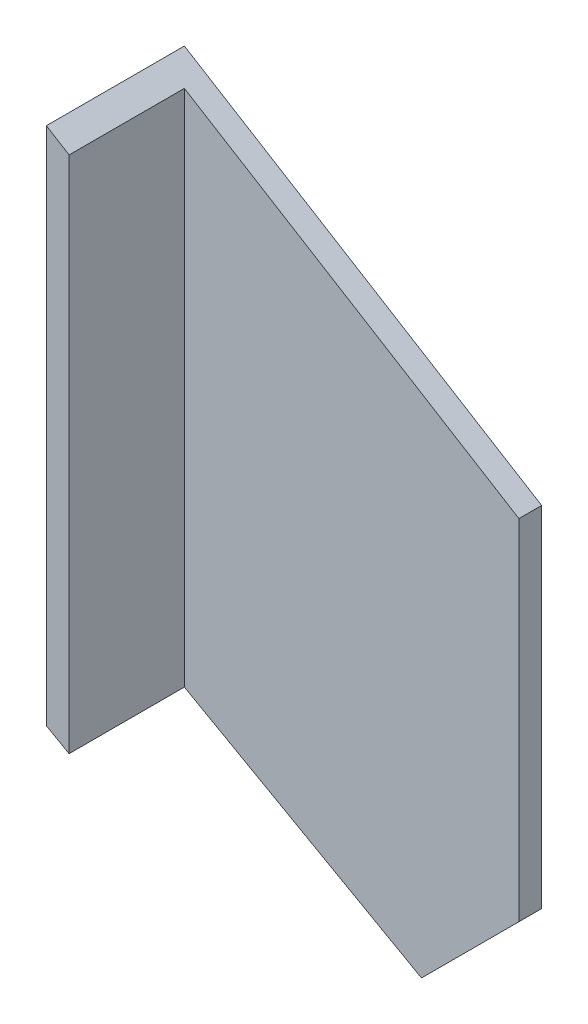
ISO-10303-21;
HEADER;
FILE_DESCRIPTION(('STEP AP214'),'2;1');
FILE_NAME('part.step','',(''),(''),'','','');
FILE_SCHEMA(('AUTOMOTIVE_DESIGN { 1 0 10303 214 1 1 1 1 }'));
ENDSEC;
DATA;
#1=APPLICATION_CONTEXT('core data for automotive mechanical design processes');
#2=APPLICATION_PROTOCOL_DEFINITION('international standard','automotive_design',2000,#1);
#3=PRODUCT_CONTEXT('',#1,'mechanical');
#4=PRODUCT('Part','Part','',(#3));
#5=PRODUCT_RELATED_PRODUCT_CATEGORY('part','',(#4));
#6=PRODUCT_DEFINITION_FORMATION('','',#4);
#7=PRODUCT_DEFINITION_CONTEXT('part definition',#1,'design');
#8=PRODUCT_DEFINITION('design','',#6,#7);
#9=PRODUCT_DEFINITION_SHAPE('','',#8);
#10=(LENGTH_UNIT() NAMED_UNIT(*) SI_UNIT(.MILLI.,.METRE.));
#11=(NAMED_UNIT(*) PLANE_ANGLE_UNIT() SI_UNIT($,.RADIAN.));
#12=(NAMED_UNIT(*) SI_UNIT($,.STERADIAN.) SOLID_ANGLE_UNIT());
#13=UNCERTAINTY_MEASURE_WITH_UNIT(LENGTH_MEASURE(1.E-05),#10,'distance_accuracy_value','');
#14=(GEOMETRIC_REPRESENTATION_CONTEXT(3) GLOBAL_UNCERTAINTY_ASSIGNED_CONTEXT((#13)) GLOBAL_UNIT_ASSIGNED_CONTEXT((#10,
#11,#12)) REPRESENTATION_CONTEXT('',''));
#15=CARTESIAN_POINT('',(0.,0.,0.));
#16=DIRECTION('',(0.,0.,1.));
#17=DIRECTION('',(1.,0.,0.));
#18=AXIS2_PLACEMENT_3D('',#15,#16,#17);
#19=CARTESIAN_POINT('',(204.674341419464,-131.464147736256,14.));
#20=DIRECTION('',(0.,0.,-1.));
#21=DIRECTION('',(-1.,0.,0.));
#22=AXIS2_PLACEMENT_3D('',#19,#20,#21);
#23=PLANE('',#22);
#24=DIRECTION('',(0.,1.,0.));
#25=VECTOR('',#24,1.);
#26=CARTESIAN_POINT('',(-134.565095200262,76.7055065531149,14.));
#27=LINE('',#26,#25);
#28=CARTESIAN_POINT('',(-134.565095200262,-242.578584355973,14.));
#29=VERTEX_POINT('',#28);
#30=CARTESIAN_POINT('',(-134.565095200262,76.7055065531149,14.));
#31=VERTEX_POINT('',#30);
#32=EDGE_CURVE('E51',#29,#31,#27,.T.);
#33=ORIENTED_EDGE('',*,*,#32,.F.);
#34=DIRECTION('',(0.87157553712455,-0.490261239632557,0.));
#35=VECTOR('',#34,1.);
#36=CARTESIAN_POINT('',(11.4349047997446,-324.703584355976,14.));
#37=LINE('',#36,#35);
#38=CARTESIAN_POINT('',(11.4349047997446,-324.703584355976,14.));
#39=VERTEX_POINT('',#38);
#40=EDGE_CURVE('E83',#29,#39,#37,.T.);
#41=ORIENTED_EDGE('',*,*,#40,.T.);
#42=DIRECTION('',(0.707106781186547,0.707106781186548,0.));
#43=VECTOR('',#42,1.);
#44=CARTESIAN_POINT('',(71.4349047997446,-264.703584355976,14.));
#45=LINE('',#44,#43);
#46=CARTESIAN_POINT('',(71.4349047997446,-264.703584355976,14.));
#47=VERTEX_POINT('',#46);
#48=EDGE_CURVE('E159',#39,#47,#45,.T.);
#49=ORIENTED_EDGE('',*,*,#48,.T.);
#50=DIRECTION('',(0.,1.,0.));
#51=VECTOR('',#50,1.);
#52=CARTESIAN_POINT('',(71.4349047997445,-49.7035843559763,14.));
#53=LINE('',#52,#51);
#54=CARTESIAN_POINT('',(71.4349047997445,-49.7035843559763,14.));
#55=VERTEX_POINT('',#54);
#56=EDGE_CURVE('E58',#47,#55,#53,.T.);
#57=ORIENTED_EDGE('',*,*,#56,.T.);
#58=DIRECTION('',(-0.852322728648673,0.523016219852579,0.));
#59=VECTOR('',#58,1.);
#60=CARTESIAN_POINT('',(-148.565095200262,85.2964156440237,14.));
#61=LINE('',#60,#59);
#62=EDGE_CURVE('E150',#55,#31,#61,.T.);
#63=ORIENTED_EDGE('',*,*,#62,.T.);
#64=EDGE_LOOP('',(#33,#41,#49,#57,#63));
#65=FACE_BOUND('',#64,.T.);
#66=ADVANCED_FACE('F34',(#65),#23,.F.);
#67=CARTESIAN_POINT('',(-148.565095200262,85.2964156440237,14.));
#68=DIRECTION('',(-0.523016219852579,-0.852322728648673,0.));
#69=DIRECTION('',(0.852322728648673,-0.523016219852579,0.));
#70=AXIS2_PLACEMENT_3D('',#67,#68,#69);
#71=PLANE('',#70);
#72=DIRECTION('',(-0.852322728648673,0.523016219852579,0.));
#73=VECTOR('',#72,1.);
#74=CARTESIAN_POINT('',(-148.565095200262,85.2964156440237,0.));
#75=LINE('',#74,#73);
#76=CARTESIAN_POINT('',(71.4349047997445,-49.7035843559763,0.));
#77=VERTEX_POINT('',#76);
#78=CARTESIAN_POINT('',(-148.565095200262,85.2964156440237,0.));
#79=VERTEX_POINT('',#78);
#80=EDGE_CURVE('E106',#77,#79,#75,.T.);
#81=ORIENTED_EDGE('',*,*,#80,.T.);
#82=DIRECTION('',(0.,0.,-1.));
#83=VECTOR('',#82,1.);
#84=CARTESIAN_POINT('',(-148.565095200262,85.2964156440237,14.));
#85=LINE('',#84,#83);
#86=CARTESIAN_POINT('',(-148.565095200262,85.2964156440237,85.));
#87=VERTEX_POINT('',#86);
#88=EDGE_CURVE('E11',#87,#79,#85,.T.);
#89=ORIENTED_EDGE('',*,*,#88,.F.);
#90=DIRECTION('',(-0.852322728648673,0.523016219852578,0.));
#91=VECTOR('',#90,1.);
#92=CARTESIAN_POINT('',(-134.565095200262,76.7055065531149,85.));
#93=LINE('',#92,#91);
#94=CARTESIAN_POINT('',(-134.565095200262,76.7055065531149,85.));
#95=VERTEX_POINT('',#94);
#96=EDGE_CURVE('E104',#95,#87,#93,.T.);
#97=ORIENTED_EDGE('',*,*,#96,.F.);
#98=DIRECTION('',(0.,0.,-1.));
#99=VECTOR('',#98,1.);
#100=CARTESIAN_POINT('',(-134.565095200262,76.7055065531149,85.));
#101=LINE('',#100,#99);
#102=EDGE_CURVE('E125',#95,#31,#101,.T.);
#103=ORIENTED_EDGE('',*,*,#102,.T.);
#104=ORIENTED_EDGE('',*,*,#62,.F.);
#105=DIRECTION('',(0.,0.,-1.));
#106=VECTOR('',#105,1.);
#107=CARTESIAN_POINT('',(71.4349047997445,-49.7035843559763,14.));
#108=LINE('',#107,#106);
#109=EDGE_CURVE('E151',#55,#77,#108,.T.);
#110=ORIENTED_EDGE('',*,*,#109,.T.);
#111=EDGE_LOOP('',(#81,#89,#97,#103,#104,#110));
#112=FACE_BOUND('',#111,.T.);
#113=ADVANCED_FACE('F36',(#112),#71,.F.);
#114=CARTESIAN_POINT('',(-148.565095200262,-234.703584355973,14.));
#115=DIRECTION('',(1.,0.,0.));
#116=DIRECTION('',(0.,0.,-1.));
#117=AXIS2_PLACEMENT_3D('',#114,#115,#116);
#118=PLANE('',#117);
#119=DIRECTION('',(0.,-1.,0.));
#120=VECTOR('',#119,1.);
#121=CARTESIAN_POINT('',(-148.565095200262,-234.703584355973,0.));
#122=LINE('',#121,#120);
#123=CARTESIAN_POINT('',(-148.565095200262,-234.703584355973,0.));
#124=VERTEX_POINT('',#123);
#125=EDGE_CURVE('E139',#79,#124,#122,.T.);
#126=ORIENTED_EDGE('',*,*,#125,.T.);
#127=DIRECTION('',(0.,0.,-1.));
#128=VECTOR('',#127,1.);
#129=CARTESIAN_POINT('',(-148.565095200262,-234.703584355973,14.));
#130=LINE('',#129,#128);
#131=CARTESIAN_POINT('',(-148.565095200262,-234.703584355973,85.));
#132=VERTEX_POINT('',#131);
#133=EDGE_CURVE('E43',#132,#124,#130,.T.);
#134=ORIENTED_EDGE('',*,*,#133,.F.);
#135=DIRECTION('',(0.,-1.,0.));
#136=VECTOR('',#135,1.);
#137=CARTESIAN_POINT('',(-148.565095200262,85.2964156440237,85.));
#138=LINE('',#137,#136);
#139=EDGE_CURVE('E109',#87,#132,#138,.T.);
#140=ORIENTED_EDGE('',*,*,#139,.F.);
#141=ORIENTED_EDGE('',*,*,#88,.T.);
#142=EDGE_LOOP('',(#126,#134,#140,#141));
#143=FACE_BOUND('',#142,.T.);
#144=ADVANCED_FACE('F110',(#143),#118,.F.);
#145=CARTESIAN_POINT('',(11.4349047997446,-324.703584355976,14.));
#146=DIRECTION('',(0.490261239632557,0.87157553712455,0.));
#147=DIRECTION('',(-0.87157553712455,0.490261239632557,0.));
#148=AXIS2_PLACEMENT_3D('',#145,#146,#147);
#149=PLANE('',#148);
#150=DIRECTION('',(0.87157553712455,-0.490261239632557,0.));
#151=VECTOR('',#150,1.);
#152=CARTESIAN_POINT('',(11.4349047997446,-324.703584355976,0.));
#153=LINE('',#152,#151);
#154=CARTESIAN_POINT('',(11.4349047997446,-324.703584355976,0.));
#155=VERTEX_POINT('',#154);
#156=EDGE_CURVE('E141',#124,#155,#153,.T.);
#157=ORIENTED_EDGE('',*,*,#156,.T.);
#158=DIRECTION('',(0.,0.,-1.));
#159=VECTOR('',#158,1.);
#160=CARTESIAN_POINT('',(11.4349047997446,-324.703584355976,14.));
#161=LINE('',#160,#159);
#162=EDGE_CURVE('E155',#39,#155,#161,.T.);
#163=ORIENTED_EDGE('',*,*,#162,.F.);
#164=ORIENTED_EDGE('',*,*,#40,.F.);
#165=DIRECTION('',(0.,0.,-1.));
#166=VECTOR('',#165,1.);
#167=CARTESIAN_POINT('',(-134.565095200262,-242.578584355973,85.));
#168=LINE('',#167,#166);
#169=CARTESIAN_POINT('',(-134.565095200262,-242.578584355973,85.));
#170=VERTEX_POINT('',#169);
#171=EDGE_CURVE('E134',#170,#29,#168,.T.);
#172=ORIENTED_EDGE('',*,*,#171,.F.);
#173=DIRECTION('',(0.87157553712455,-0.490261239632557,0.));
#174=VECTOR('',#173,1.);
#175=CARTESIAN_POINT('',(-148.565095200262,-234.703584355973,85.));
#176=LINE('',#175,#174);
#177=EDGE_CURVE('E114',#132,#170,#176,.T.);
#178=ORIENTED_EDGE('',*,*,#177,.F.);
#179=ORIENTED_EDGE('',*,*,#133,.T.);
#180=EDGE_LOOP('',(#157,#163,#164,#172,#178,#179));
#181=FACE_BOUND('',#180,.T.);
#182=ADVANCED_FACE('F188',(#181),#149,.F.);
#183=CARTESIAN_POINT('',(71.4349047997446,-264.703584355976,14.));
#184=DIRECTION('',(-0.707106781186548,0.707106781186547,0.));
#185=DIRECTION('',(-0.707106781186547,-0.707106781186548,0.));
#186=AXIS2_PLACEMENT_3D('',#183,#184,#185);
#187=PLANE('',#186);
#188=DIRECTION('',(0.707106781186547,0.707106781186548,0.));
#189=VECTOR('',#188,1.);
#190=CARTESIAN_POINT('',(71.4349047997446,-264.703584355976,0.));
#191=LINE('',#190,#189);
#192=CARTESIAN_POINT('',(71.4349047997446,-264.703584355976,0.));
#193=VERTEX_POINT('',#192);
#194=EDGE_CURVE('E147',#155,#193,#191,.T.);
#195=ORIENTED_EDGE('',*,*,#194,.T.);
#196=DIRECTION('',(0.,0.,-1.));
#197=VECTOR('',#196,1.);
#198=CARTESIAN_POINT('',(71.4349047997446,-264.703584355976,14.));
#199=LINE('',#198,#197);
#200=EDGE_CURVE('E153',#47,#193,#199,.T.);
#201=ORIENTED_EDGE('',*,*,#200,.F.);
#202=ORIENTED_EDGE('',*,*,#48,.F.);
#203=ORIENTED_EDGE('',*,*,#162,.T.);
#204=EDGE_LOOP('',(#195,#201,#202,#203));
#205=FACE_BOUND('',#204,.T.);
#206=ADVANCED_FACE('F164',(#205),#187,.F.);
#207=CARTESIAN_POINT('',(71.4349047997445,-49.7035843559763,14.));
#208=DIRECTION('',(-1.,0.,0.));
#209=DIRECTION('',(0.,-1.,0.));
#210=AXIS2_PLACEMENT_3D('',#207,#208,#209);
#211=PLANE('',#210);
#212=DIRECTION('',(0.,1.,0.));
#213=VECTOR('',#212,1.);
#214=CARTESIAN_POINT('',(71.4349047997445,-49.7035843559763,0.));
#215=LINE('',#214,#213);
#216=EDGE_CURVE('E81',#193,#77,#215,.T.);
#217=ORIENTED_EDGE('',*,*,#216,.T.);
#218=ORIENTED_EDGE('',*,*,#109,.F.);
#219=ORIENTED_EDGE('',*,*,#56,.F.);
#220=ORIENTED_EDGE('',*,*,#200,.T.);
#221=EDGE_LOOP('',(#217,#218,#219,#220));
#222=FACE_BOUND('',#221,.T.);
#223=ADVANCED_FACE('F166',(#222),#211,.F.);
#224=CARTESIAN_POINT('',(204.674341419464,-131.464147736256,0.));
#225=DIRECTION('',(0.,0.,-1.));
#226=DIRECTION('',(-1.,0.,0.));
#227=AXIS2_PLACEMENT_3D('',#224,#225,#226);
#228=PLANE('',#227);
#229=ORIENTED_EDGE('',*,*,#80,.F.);
#230=ORIENTED_EDGE('',*,*,#216,.F.);
#231=ORIENTED_EDGE('',*,*,#194,.F.);
#232=ORIENTED_EDGE('',*,*,#156,.F.);
#233=ORIENTED_EDGE('',*,*,#125,.F.);
#234=EDGE_LOOP('',(#229,#230,#231,#232,#233));
#235=FACE_BOUND('',#234,.T.);
#236=ADVANCED_FACE('F169',(#235),#228,.T.);
#237=CARTESIAN_POINT('',(-134.565095200262,76.7055065531149,85.));
#238=DIRECTION('',(-1.,0.,0.));
#239=DIRECTION('',(0.,-1.,0.));
#240=AXIS2_PLACEMENT_3D('',#237,#238,#239);
#241=PLANE('',#240);
#242=ORIENTED_EDGE('',*,*,#32,.T.);
#243=ORIENTED_EDGE('',*,*,#102,.F.);
#244=DIRECTION('',(0.,1.,0.));
#245=VECTOR('',#244,1.);
#246=CARTESIAN_POINT('',(-134.565095200262,76.7055065531149,85.));
#247=LINE('',#246,#245);
#248=EDGE_CURVE('E118',#170,#95,#247,.T.);
#249=ORIENTED_EDGE('',*,*,#248,.F.);
#250=ORIENTED_EDGE('',*,*,#171,.T.);
#251=EDGE_LOOP('',(#242,#243,#249,#250));
#252=FACE_BOUND('',#251,.T.);
#253=ADVANCED_FACE('F167',(#252),#241,.F.);
#254=CARTESIAN_POINT('',(-148.565095200262,85.2964156440237,85.));
#255=DIRECTION('',(0.,0.,1.));
#256=DIRECTION('',(1.,0.,0.));
#257=AXIS2_PLACEMENT_3D('',#254,#255,#256);
#258=PLANE('',#257);
#259=ORIENTED_EDGE('',*,*,#96,.T.);
#260=ORIENTED_EDGE('',*,*,#139,.T.);
#261=ORIENTED_EDGE('',*,*,#177,.T.);
#262=ORIENTED_EDGE('',*,*,#248,.T.);
#263=EDGE_LOOP('',(#259,#260,#261,#262));
#264=FACE_BOUND('',#263,.T.);
#265=ADVANCED_FACE('F116',(#264),#258,.T.);
#266=CLOSED_SHELL('',(#66,#113,#144,#182,#206,#223,#236,#253,#265));
#267=MANIFOLD_SOLID_BREP('B2',#266);
#268=ADVANCED_BREP_SHAPE_REPRESENTATION('',(#18,#267),#14);
#269=SHAPE_DEFINITION_REPRESENTATION(#9,#268);
ENDSEC;
END-ISO-10303-21;
